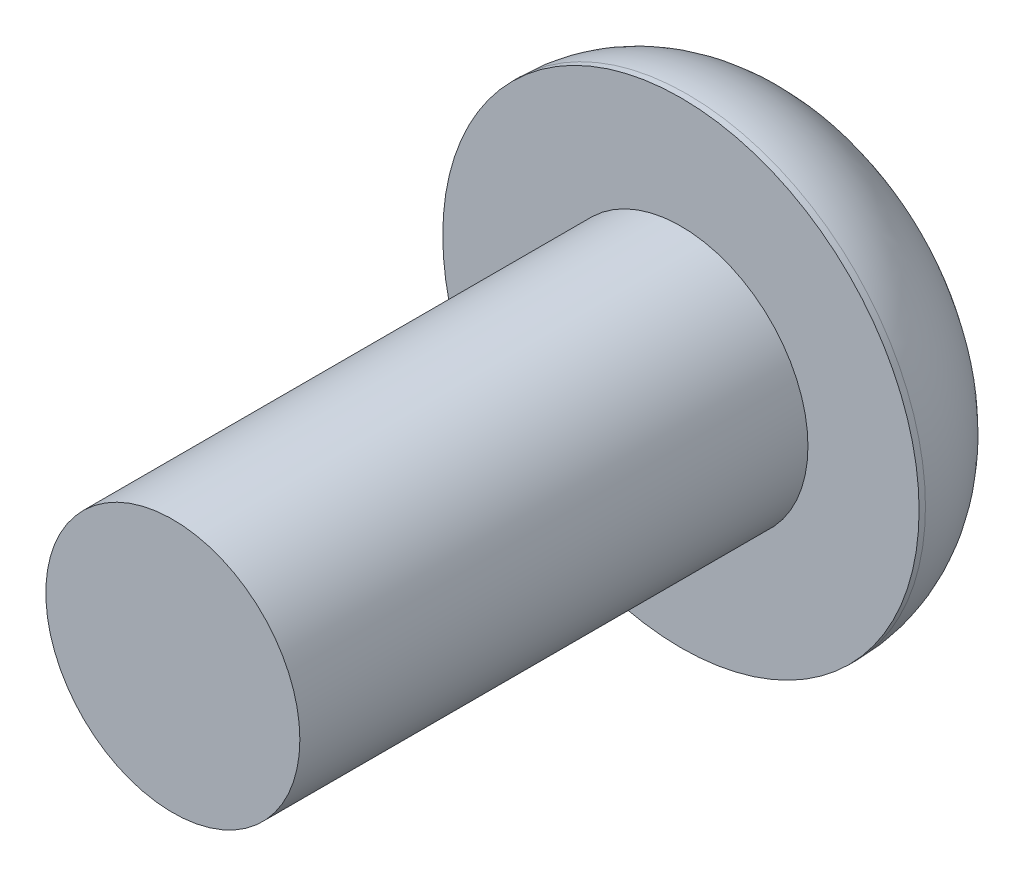
ISO-10303-21;
HEADER;
FILE_DESCRIPTION(('STEP AP214'),'2;1');
FILE_NAME('part.step','',(''),(''),'','','');
FILE_SCHEMA(('AUTOMOTIVE_DESIGN { 1 0 10303 214 1 1 1 1 }'));
ENDSEC;
DATA;
#1=APPLICATION_CONTEXT('core data for automotive mechanical design processes');
#2=APPLICATION_PROTOCOL_DEFINITION('international standard','automotive_design',2000,#1);
#3=PRODUCT_CONTEXT('',#1,'mechanical');
#4=PRODUCT('Part','Part','',(#3));
#5=PRODUCT_RELATED_PRODUCT_CATEGORY('part','',(#4));
#6=PRODUCT_DEFINITION_FORMATION('','',#4);
#7=PRODUCT_DEFINITION_CONTEXT('part definition',#1,'design');
#8=PRODUCT_DEFINITION('design','',#6,#7);
#9=PRODUCT_DEFINITION_SHAPE('','',#8);
#10=(LENGTH_UNIT() NAMED_UNIT(*) SI_UNIT(.MILLI.,.METRE.));
#11=(NAMED_UNIT(*) PLANE_ANGLE_UNIT() SI_UNIT($,.RADIAN.));
#12=(NAMED_UNIT(*) SI_UNIT($,.STERADIAN.) SOLID_ANGLE_UNIT());
#13=UNCERTAINTY_MEASURE_WITH_UNIT(LENGTH_MEASURE(1.E-05),#10,'distance_accuracy_value','');
#14=(GEOMETRIC_REPRESENTATION_CONTEXT(3) GLOBAL_UNCERTAINTY_ASSIGNED_CONTEXT((#13)) GLOBAL_UNIT_ASSIGNED_CONTEXT((#10,
#11,#12)) REPRESENTATION_CONTEXT('',''));
#15=CARTESIAN_POINT('',(0.,0.,0.));
#16=DIRECTION('',(0.,0.,1.));
#17=DIRECTION('',(1.,0.,0.));
#18=AXIS2_PLACEMENT_3D('',#15,#16,#17);
#19=CARTESIAN_POINT('',(0.,0.,8.));
#20=DIRECTION('',(0.,0.,-1.));
#21=DIRECTION('',(-1.,0.,0.));
#22=AXIS2_PLACEMENT_3D('',#19,#20,#21);
#23=CYLINDRICAL_SURFACE('',#22,2.);
#24=CARTESIAN_POINT('',(0.,0.,8.));
#25=DIRECTION('',(0.,0.,1.));
#26=DIRECTION('',(1.,0.,0.));
#27=AXIS2_PLACEMENT_3D('',#24,#25,#26);
#28=CIRCLE('',#27,2.);
#29=CARTESIAN_POINT('',(2.,0.,8.));
#30=VERTEX_POINT('',#29);
#31=EDGE_CURVE('E50',#30,#30,#28,.T.);
#32=ORIENTED_EDGE('',*,*,#31,.F.);
#33=EDGE_LOOP('',(#32));
#34=FACE_BOUND('',#33,.T.);
#35=CARTESIAN_POINT('',(0.,0.,0.));
#36=DIRECTION('',(0.,0.,1.));
#37=DIRECTION('',(1.,0.,0.));
#38=AXIS2_PLACEMENT_3D('',#35,#36,#37);
#39=CIRCLE('',#38,2.);
#40=CARTESIAN_POINT('',(2.,0.,0.));
#41=VERTEX_POINT('',#40);
#42=EDGE_CURVE('E55',#41,#41,#39,.T.);
#43=ORIENTED_EDGE('',*,*,#42,.T.);
#44=EDGE_LOOP('',(#43));
#45=FACE_BOUND('',#44,.T.);
#46=ADVANCED_FACE('F37',(#34,#45),#23,.T.);
#47=CARTESIAN_POINT('',(0.,0.,8.));
#48=DIRECTION('',(0.,0.,1.));
#49=DIRECTION('',(1.,0.,0.));
#50=AXIS2_PLACEMENT_3D('',#47,#48,#49);
#51=PLANE('',#50);
#52=ORIENTED_EDGE('',*,*,#31,.T.);
#53=EDGE_LOOP('',(#52));
#54=FACE_BOUND('',#53,.T.);
#55=ADVANCED_FACE('F82',(#54),#51,.T.);
#56=CARTESIAN_POINT('',(0.,0.,-2.1));
#57=DIRECTION('',(0.,0.,1.));
#58=DIRECTION('',(1.,0.,0.));
#59=AXIS2_PLACEMENT_3D('',#56,#57,#58);
#60=CYLINDRICAL_SURFACE('',#59,3.75);
#61=CARTESIAN_POINT('',(0.,0.,-0.1));
#62=DIRECTION('',(0.,0.,-1.));
#63=DIRECTION('',(-1.,0.,0.));
#64=AXIS2_PLACEMENT_3D('',#61,#62,#63);
#65=CIRCLE('',#64,3.75);
#66=CARTESIAN_POINT('',(-3.75,0.,-0.1));
#67=VERTEX_POINT('',#66);
#68=EDGE_CURVE('E10',#67,#67,#65,.F.);
#69=ORIENTED_EDGE('',*,*,#68,.T.);
#70=EDGE_LOOP('',(#69));
#71=FACE_BOUND('',#70,.T.);
#72=CARTESIAN_POINT('',(0.,0.,0.));
#73=DIRECTION('',(0.,0.,-1.));
#74=DIRECTION('',(-1.,0.,0.));
#75=AXIS2_PLACEMENT_3D('',#72,#73,#74);
#76=CIRCLE('',#75,3.75);
#77=CARTESIAN_POINT('',(-3.75,0.,0.));
#78=VERTEX_POINT('',#77);
#79=EDGE_CURVE('E60',#78,#78,#76,.T.);
#80=ORIENTED_EDGE('',*,*,#79,.T.);
#81=EDGE_LOOP('',(#80));
#82=FACE_BOUND('',#81,.T.);
#83=ADVANCED_FACE('F66',(#71,#82),#60,.T.);
#84=CARTESIAN_POINT('',(0.,0.,-2.1));
#85=DIRECTION('',(0.,0.,-1.));
#86=DIRECTION('',(-1.,0.,0.));
#87=AXIS2_PLACEMENT_3D('',#84,#85,#86);
#88=PLANE('',#87);
#89=CARTESIAN_POINT('',(0.,0.,-2.1));
#90=DIRECTION('',(0.,0.,-1.));
#91=DIRECTION('',(-1.,0.,0.));
#92=AXIS2_PLACEMENT_3D('',#89,#90,#91);
#93=CIRCLE('',#92,1.75);
#94=CARTESIAN_POINT('',(-1.75,0.,-2.1));
#95=VERTEX_POINT('',#94);
#96=EDGE_CURVE('E45',#95,#95,#93,.T.);
#97=ORIENTED_EDGE('',*,*,#96,.T.);
#98=EDGE_LOOP('',(#97));
#99=FACE_BOUND('',#98,.T.);
#100=ADVANCED_FACE('F70',(#99),#88,.T.);
#101=CARTESIAN_POINT('',(0.,0.,0.));
#102=DIRECTION('',(0.,0.,-1.));
#103=DIRECTION('',(-1.,0.,0.));
#104=AXIS2_PLACEMENT_3D('',#101,#102,#103);
#105=PLANE('',#104);
#106=ORIENTED_EDGE('',*,*,#42,.F.);
#107=EDGE_LOOP('',(#106));
#108=FACE_BOUND('',#107,.T.);
#109=ORIENTED_EDGE('',*,*,#79,.F.);
#110=EDGE_LOOP('',(#109));
#111=FACE_BOUND('',#110,.T.);
#112=ADVANCED_FACE('F68',(#108,#111),#105,.F.);
#113=CARTESIAN_POINT('',(0.,0.,-0.1));
#114=DIRECTION('',(0.,0.,-1.));
#115=DIRECTION('',(-1.,0.,0.));
#116=AXIS2_PLACEMENT_3D('',#113,#114,#115);
#117=DEGENERATE_TOROIDAL_SURFACE('',#116,1.75,2.,.T.);
#118=ORIENTED_EDGE('',*,*,#68,.F.);
#119=EDGE_LOOP('',(#118));
#120=FACE_BOUND('',#119,.T.);
#121=ORIENTED_EDGE('',*,*,#96,.F.);
#122=EDGE_LOOP('',(#121));
#123=FACE_BOUND('',#122,.T.);
#124=ADVANCED_FACE('F39',(#120,#123),#117,.T.);
#125=CLOSED_SHELL('',(#46,#55,#83,#100,#112,#124));
#126=MANIFOLD_SOLID_BREP('B2',#125);
#127=ADVANCED_BREP_SHAPE_REPRESENTATION('',(#18,#126),#14);
#128=SHAPE_DEFINITION_REPRESENTATION(#9,#127);
ENDSEC;
END-ISO-10303-21;
